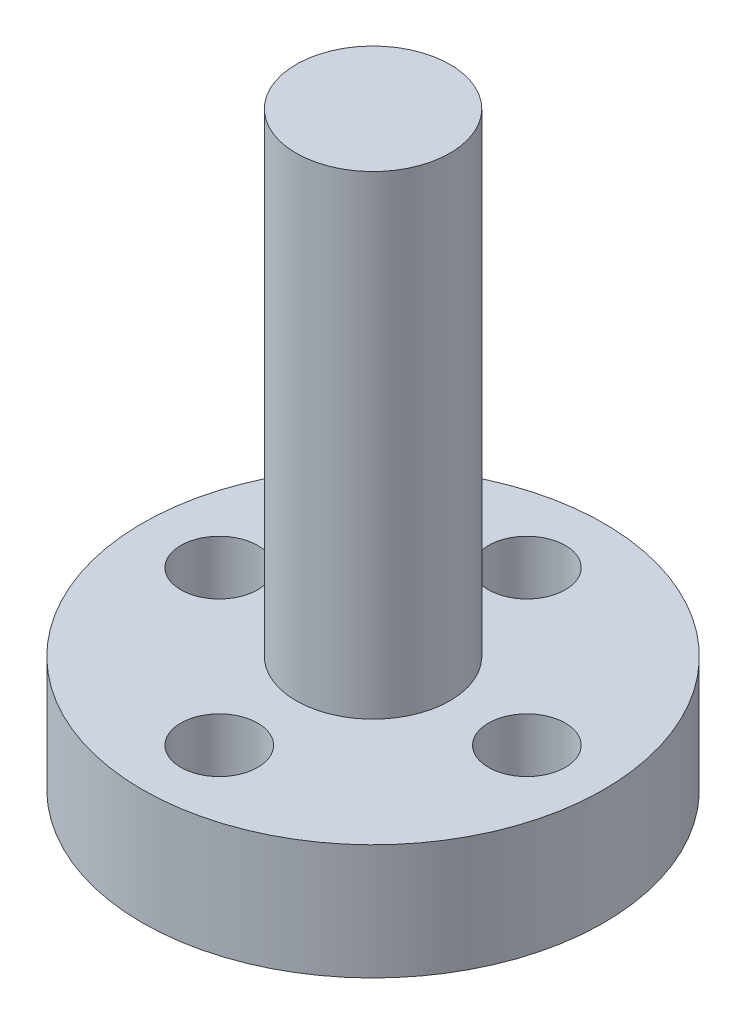
ISO-10303-21;
HEADER;
FILE_DESCRIPTION(('STEP AP214'),'2;1');
FILE_NAME('part.step','',(''),(''),'','','');
FILE_SCHEMA(('AUTOMOTIVE_DESIGN { 1 0 10303 214 1 1 1 1 }'));
ENDSEC;
DATA;
#1=APPLICATION_CONTEXT('core data for automotive mechanical design processes');
#2=APPLICATION_PROTOCOL_DEFINITION('international standard','automotive_design',2000,#1);
#3=PRODUCT_CONTEXT('',#1,'mechanical');
#4=PRODUCT('Part','Part','',(#3));
#5=PRODUCT_RELATED_PRODUCT_CATEGORY('part','',(#4));
#6=PRODUCT_DEFINITION_FORMATION('','',#4);
#7=PRODUCT_DEFINITION_CONTEXT('part definition',#1,'design');
#8=PRODUCT_DEFINITION('design','',#6,#7);
#9=PRODUCT_DEFINITION_SHAPE('','',#8);
#10=(LENGTH_UNIT() NAMED_UNIT(*) SI_UNIT(.MILLI.,.METRE.));
#11=(NAMED_UNIT(*) PLANE_ANGLE_UNIT() SI_UNIT($,.RADIAN.));
#12=(NAMED_UNIT(*) SI_UNIT($,.STERADIAN.) SOLID_ANGLE_UNIT());
#13=UNCERTAINTY_MEASURE_WITH_UNIT(LENGTH_MEASURE(1.E-05),#10,'distance_accuracy_value','');
#14=(GEOMETRIC_REPRESENTATION_CONTEXT(3) GLOBAL_UNCERTAINTY_ASSIGNED_CONTEXT((#13)) GLOBAL_UNIT_ASSIGNED_CONTEXT((#10,
#11,#12)) REPRESENTATION_CONTEXT('',''));
#15=CARTESIAN_POINT('',(0.,0.,0.));
#16=DIRECTION('',(0.,0.,1.));
#17=DIRECTION('',(1.,0.,0.));
#18=AXIS2_PLACEMENT_3D('',#15,#16,#17);
#19=CARTESIAN_POINT('',(0.,4.5,0.));
#20=DIRECTION('',(0.,-1.,0.));
#21=DIRECTION('',(0.,0.,-1.));
#22=AXIS2_PLACEMENT_3D('',#19,#20,#21);
#23=CYLINDRICAL_SURFACE('',#22,9.);
#24=CARTESIAN_POINT('',(0.,4.5,0.));
#25=DIRECTION('',(0.,1.,0.));
#26=DIRECTION('',(0.,0.,1.));
#27=AXIS2_PLACEMENT_3D('',#24,#25,#26);
#28=CIRCLE('',#27,9.);
#29=CARTESIAN_POINT('',(0.,4.5,9.));
#30=VERTEX_POINT('',#29);
#31=EDGE_CURVE('E10',#30,#30,#28,.T.);
#32=ORIENTED_EDGE('',*,*,#31,.F.);
#33=EDGE_LOOP('',(#32));
#34=FACE_BOUND('',#33,.T.);
#35=CARTESIAN_POINT('',(0.,0.,0.));
#36=DIRECTION('',(0.,1.,0.));
#37=DIRECTION('',(0.,0.,1.));
#38=AXIS2_PLACEMENT_3D('',#35,#36,#37);
#39=CIRCLE('',#38,9.);
#40=CARTESIAN_POINT('',(0.,0.,9.));
#41=VERTEX_POINT('',#40);
#42=EDGE_CURVE('E39',#41,#41,#39,.T.);
#43=ORIENTED_EDGE('',*,*,#42,.T.);
#44=EDGE_LOOP('',(#43));
#45=FACE_BOUND('',#44,.T.);
#46=ADVANCED_FACE('F36',(#34,#45),#23,.T.);
#47=CARTESIAN_POINT('',(0.,4.5,0.));
#48=DIRECTION('',(0.,1.,0.));
#49=DIRECTION('',(0.,0.,1.));
#50=AXIS2_PLACEMENT_3D('',#47,#48,#49);
#51=PLANE('',#50);
#52=CARTESIAN_POINT('',(0.,4.5,0.));
#53=DIRECTION('',(0.,1.,0.));
#54=DIRECTION('',(0.,0.,1.));
#55=AXIS2_PLACEMENT_3D('',#52,#53,#54);
#56=CIRCLE('',#55,3.);
#57=CARTESIAN_POINT('',(0.,4.5,3.));
#58=VERTEX_POINT('',#57);
#59=EDGE_CURVE('E78',#58,#58,#56,.T.);
#60=ORIENTED_EDGE('',*,*,#59,.F.);
#61=EDGE_LOOP('',(#60));
#62=FACE_BOUND('',#61,.T.);
#63=CARTESIAN_POINT('',(6.,4.5,0.));
#64=DIRECTION('',(0.,-1.,0.));
#65=DIRECTION('',(0.,0.,-1.));
#66=AXIS2_PLACEMENT_3D('',#63,#64,#65);
#67=CIRCLE('',#66,1.5);
#68=CARTESIAN_POINT('',(6.,4.5,-1.50000000000002));
#69=VERTEX_POINT('',#68);
#70=EDGE_CURVE('E57',#69,#69,#67,.T.);
#71=ORIENTED_EDGE('',*,*,#70,.T.);
#72=EDGE_LOOP('',(#71));
#73=FACE_BOUND('',#72,.T.);
#74=CARTESIAN_POINT('',(0.,4.5,-6.));
#75=DIRECTION('',(0.,-1.,0.));
#76=DIRECTION('',(0.,0.,-1.));
#77=AXIS2_PLACEMENT_3D('',#74,#75,#76);
#78=CIRCLE('',#77,1.5);
#79=CARTESIAN_POINT('',(0.,4.5,-7.5));
#80=VERTEX_POINT('',#79);
#81=EDGE_CURVE('E70',#80,#80,#78,.T.);
#82=ORIENTED_EDGE('',*,*,#81,.T.);
#83=EDGE_LOOP('',(#82));
#84=FACE_BOUND('',#83,.T.);
#85=CARTESIAN_POINT('',(-6.,4.5,0.));
#86=DIRECTION('',(0.,-1.,0.));
#87=DIRECTION('',(0.,0.,-1.));
#88=AXIS2_PLACEMENT_3D('',#85,#86,#87);
#89=CIRCLE('',#88,1.5);
#90=CARTESIAN_POINT('',(-6.,4.5,-1.49999999999994));
#91=VERTEX_POINT('',#90);
#92=EDGE_CURVE('E63',#91,#91,#89,.T.);
#93=ORIENTED_EDGE('',*,*,#92,.T.);
#94=EDGE_LOOP('',(#93));
#95=FACE_BOUND('',#94,.T.);
#96=CARTESIAN_POINT('',(0.,4.5,6.));
#97=DIRECTION('',(0.,-1.,0.));
#98=DIRECTION('',(0.,0.,-1.));
#99=AXIS2_PLACEMENT_3D('',#96,#97,#98);
#100=CIRCLE('',#99,1.5);
#101=CARTESIAN_POINT('',(0.,4.5,4.5));
#102=VERTEX_POINT('',#101);
#103=EDGE_CURVE('E51',#102,#102,#100,.T.);
#104=ORIENTED_EDGE('',*,*,#103,.T.);
#105=EDGE_LOOP('',(#104));
#106=FACE_BOUND('',#105,.T.);
#107=ORIENTED_EDGE('',*,*,#31,.T.);
#108=EDGE_LOOP('',(#107));
#109=FACE_BOUND('',#108,.T.);
#110=ADVANCED_FACE('F93',(#62,#73,#84,#95,#106,#109),#51,.T.);
#111=CARTESIAN_POINT('',(0.,0.,0.));
#112=DIRECTION('',(0.,1.,0.));
#113=DIRECTION('',(0.,0.,1.));
#114=AXIS2_PLACEMENT_3D('',#111,#112,#113);
#115=PLANE('',#114);
#116=CARTESIAN_POINT('',(6.,0.,0.));
#117=DIRECTION('',(0.,-1.,0.));
#118=DIRECTION('',(0.,0.,-1.));
#119=AXIS2_PLACEMENT_3D('',#116,#117,#118);
#120=CIRCLE('',#119,1.5);
#121=CARTESIAN_POINT('',(6.,0.,-1.50000000000002));
#122=VERTEX_POINT('',#121);
#123=EDGE_CURVE('E73',#122,#122,#120,.T.);
#124=ORIENTED_EDGE('',*,*,#123,.F.);
#125=EDGE_LOOP('',(#124));
#126=FACE_BOUND('',#125,.T.);
#127=CARTESIAN_POINT('',(0.,0.,-6.));
#128=DIRECTION('',(0.,-1.,0.));
#129=DIRECTION('',(0.,0.,-1.));
#130=AXIS2_PLACEMENT_3D('',#127,#128,#129);
#131=CIRCLE('',#130,1.5);
#132=CARTESIAN_POINT('',(0.,0.,-7.5));
#133=VERTEX_POINT('',#132);
#134=EDGE_CURVE('E67',#133,#133,#131,.T.);
#135=ORIENTED_EDGE('',*,*,#134,.F.);
#136=EDGE_LOOP('',(#135));
#137=FACE_BOUND('',#136,.T.);
#138=CARTESIAN_POINT('',(-6.,0.,0.));
#139=DIRECTION('',(0.,-1.,0.));
#140=DIRECTION('',(0.,0.,-1.));
#141=AXIS2_PLACEMENT_3D('',#138,#139,#140);
#142=CIRCLE('',#141,1.5);
#143=CARTESIAN_POINT('',(-6.,0.,-1.49999999999994));
#144=VERTEX_POINT('',#143);
#145=EDGE_CURVE('E60',#144,#144,#142,.T.);
#146=ORIENTED_EDGE('',*,*,#145,.F.);
#147=EDGE_LOOP('',(#146));
#148=FACE_BOUND('',#147,.T.);
#149=CARTESIAN_POINT('',(0.,0.,6.));
#150=DIRECTION('',(0.,-1.,0.));
#151=DIRECTION('',(0.,0.,-1.));
#152=AXIS2_PLACEMENT_3D('',#149,#150,#151);
#153=CIRCLE('',#152,1.5);
#154=CARTESIAN_POINT('',(0.,0.,4.5));
#155=VERTEX_POINT('',#154);
#156=EDGE_CURVE('E54',#155,#155,#153,.T.);
#157=ORIENTED_EDGE('',*,*,#156,.F.);
#158=EDGE_LOOP('',(#157));
#159=FACE_BOUND('',#158,.T.);
#160=CARTESIAN_POINT('',(0.,0.,0.));
#161=DIRECTION('',(0.,-1.,0.));
#162=DIRECTION('',(0.,0.,-1.));
#163=AXIS2_PLACEMENT_3D('',#160,#161,#162);
#164=CIRCLE('',#163,2.);
#165=CARTESIAN_POINT('',(0.,0.,-2.));
#166=VERTEX_POINT('',#165);
#167=EDGE_CURVE('E48',#166,#166,#164,.T.);
#168=ORIENTED_EDGE('',*,*,#167,.F.);
#169=EDGE_LOOP('',(#168));
#170=FACE_BOUND('',#169,.T.);
#171=ORIENTED_EDGE('',*,*,#42,.F.);
#172=EDGE_LOOP('',(#171));
#173=FACE_BOUND('',#172,.T.);
#174=ADVANCED_FACE('F96',(#126,#137,#148,#159,#170,#173),#115,.F.);
#175=CARTESIAN_POINT('',(0.,2.,0.));
#176=DIRECTION('',(0.,-1.,0.));
#177=DIRECTION('',(0.,0.,-1.));
#178=AXIS2_PLACEMENT_3D('',#175,#176,#177);
#179=CYLINDRICAL_SURFACE('',#178,2.);
#180=CARTESIAN_POINT('',(0.,2.,0.));
#181=DIRECTION('',(0.,-1.,0.));
#182=DIRECTION('',(0.,0.,-1.));
#183=AXIS2_PLACEMENT_3D('',#180,#181,#182);
#184=CIRCLE('',#183,2.);
#185=CARTESIAN_POINT('',(0.,2.,-2.));
#186=VERTEX_POINT('',#185);
#187=EDGE_CURVE('E46',#186,#186,#184,.T.);
#188=ORIENTED_EDGE('',*,*,#187,.F.);
#189=EDGE_LOOP('',(#188));
#190=FACE_BOUND('',#189,.T.);
#191=ORIENTED_EDGE('',*,*,#167,.T.);
#192=EDGE_LOOP('',(#191));
#193=FACE_BOUND('',#192,.T.);
#194=ADVANCED_FACE('F116',(#190,#193),#179,.F.);
#195=CARTESIAN_POINT('',(0.,2.,0.));
#196=DIRECTION('',(0.,-1.,0.));
#197=DIRECTION('',(0.,0.,-1.));
#198=AXIS2_PLACEMENT_3D('',#195,#196,#197);
#199=PLANE('',#198);
#200=ORIENTED_EDGE('',*,*,#187,.T.);
#201=EDGE_LOOP('',(#200));
#202=FACE_BOUND('',#201,.T.);
#203=ADVANCED_FACE('F110',(#202),#199,.T.);
#204=CARTESIAN_POINT('',(0.,4.5,6.));
#205=DIRECTION('',(0.,-1.,0.));
#206=DIRECTION('',(0.,0.,-1.));
#207=AXIS2_PLACEMENT_3D('',#204,#205,#206);
#208=CYLINDRICAL_SURFACE('',#207,1.5);
#209=ORIENTED_EDGE('',*,*,#103,.F.);
#210=EDGE_LOOP('',(#209));
#211=FACE_BOUND('',#210,.T.);
#212=ORIENTED_EDGE('',*,*,#156,.T.);
#213=EDGE_LOOP('',(#212));
#214=FACE_BOUND('',#213,.T.);
#215=ADVANCED_FACE('F106',(#211,#214),#208,.F.);
#216=CARTESIAN_POINT('',(-6.,4.5,0.));
#217=DIRECTION('',(0.,-1.,0.));
#218=DIRECTION('',(0.,0.,-1.));
#219=AXIS2_PLACEMENT_3D('',#216,#217,#218);
#220=CYLINDRICAL_SURFACE('',#219,1.5);
#221=ORIENTED_EDGE('',*,*,#92,.F.);
#222=EDGE_LOOP('',(#221));
#223=FACE_BOUND('',#222,.T.);
#224=ORIENTED_EDGE('',*,*,#145,.T.);
#225=EDGE_LOOP('',(#224));
#226=FACE_BOUND('',#225,.T.);
#227=ADVANCED_FACE('F109',(#223,#226),#220,.F.);
#228=CARTESIAN_POINT('',(0.,4.5,-6.));
#229=DIRECTION('',(0.,-1.,0.));
#230=DIRECTION('',(0.,0.,-1.));
#231=AXIS2_PLACEMENT_3D('',#228,#229,#230);
#232=CYLINDRICAL_SURFACE('',#231,1.5);
#233=ORIENTED_EDGE('',*,*,#81,.F.);
#234=EDGE_LOOP('',(#233));
#235=FACE_BOUND('',#234,.T.);
#236=ORIENTED_EDGE('',*,*,#134,.T.);
#237=EDGE_LOOP('',(#236));
#238=FACE_BOUND('',#237,.T.);
#239=ADVANCED_FACE('F160',(#235,#238),#232,.F.);
#240=CARTESIAN_POINT('',(6.,4.5,0.));
#241=DIRECTION('',(0.,-1.,0.));
#242=DIRECTION('',(0.,0.,-1.));
#243=AXIS2_PLACEMENT_3D('',#240,#241,#242);
#244=CYLINDRICAL_SURFACE('',#243,1.5);
#245=ORIENTED_EDGE('',*,*,#70,.F.);
#246=EDGE_LOOP('',(#245));
#247=FACE_BOUND('',#246,.T.);
#248=ORIENTED_EDGE('',*,*,#123,.T.);
#249=EDGE_LOOP('',(#248));
#250=FACE_BOUND('',#249,.T.);
#251=ADVANCED_FACE('F89',(#247,#250),#244,.F.);
#252=CARTESIAN_POINT('',(0.,23.,0.));
#253=DIRECTION('',(0.,-1.,0.));
#254=DIRECTION('',(0.,0.,-1.));
#255=AXIS2_PLACEMENT_3D('',#252,#253,#254);
#256=CYLINDRICAL_SURFACE('',#255,3.);
#257=CARTESIAN_POINT('',(0.,23.,0.));
#258=DIRECTION('',(0.,1.,0.));
#259=DIRECTION('',(0.,0.,1.));
#260=AXIS2_PLACEMENT_3D('',#257,#258,#259);
#261=CIRCLE('',#260,3.);
#262=CARTESIAN_POINT('',(0.,23.,3.));
#263=VERTEX_POINT('',#262);
#264=EDGE_CURVE('E64',#263,#263,#261,.T.);
#265=ORIENTED_EDGE('',*,*,#264,.F.);
#266=EDGE_LOOP('',(#265));
#267=FACE_BOUND('',#266,.T.);
#268=ORIENTED_EDGE('',*,*,#59,.T.);
#269=EDGE_LOOP('',(#268));
#270=FACE_BOUND('',#269,.T.);
#271=ADVANCED_FACE('F86',(#267,#270),#256,.T.);
#272=CARTESIAN_POINT('',(0.,23.,0.));
#273=DIRECTION('',(0.,1.,0.));
#274=DIRECTION('',(0.,0.,1.));
#275=AXIS2_PLACEMENT_3D('',#272,#273,#274);
#276=PLANE('',#275);
#277=ORIENTED_EDGE('',*,*,#264,.T.);
#278=EDGE_LOOP('',(#277));
#279=FACE_BOUND('',#278,.T.);
#280=ADVANCED_FACE('F84',(#279),#276,.T.);
#281=CLOSED_SHELL('',(#46,#110,#174,#194,#203,#215,#227,#239,#251,#271,#280));
#282=MANIFOLD_SOLID_BREP('B2',#281);
#283=ADVANCED_BREP_SHAPE_REPRESENTATION('',(#18,#282),#14);
#284=SHAPE_DEFINITION_REPRESENTATION(#9,#283);
ENDSEC;
END-ISO-10303-21;
